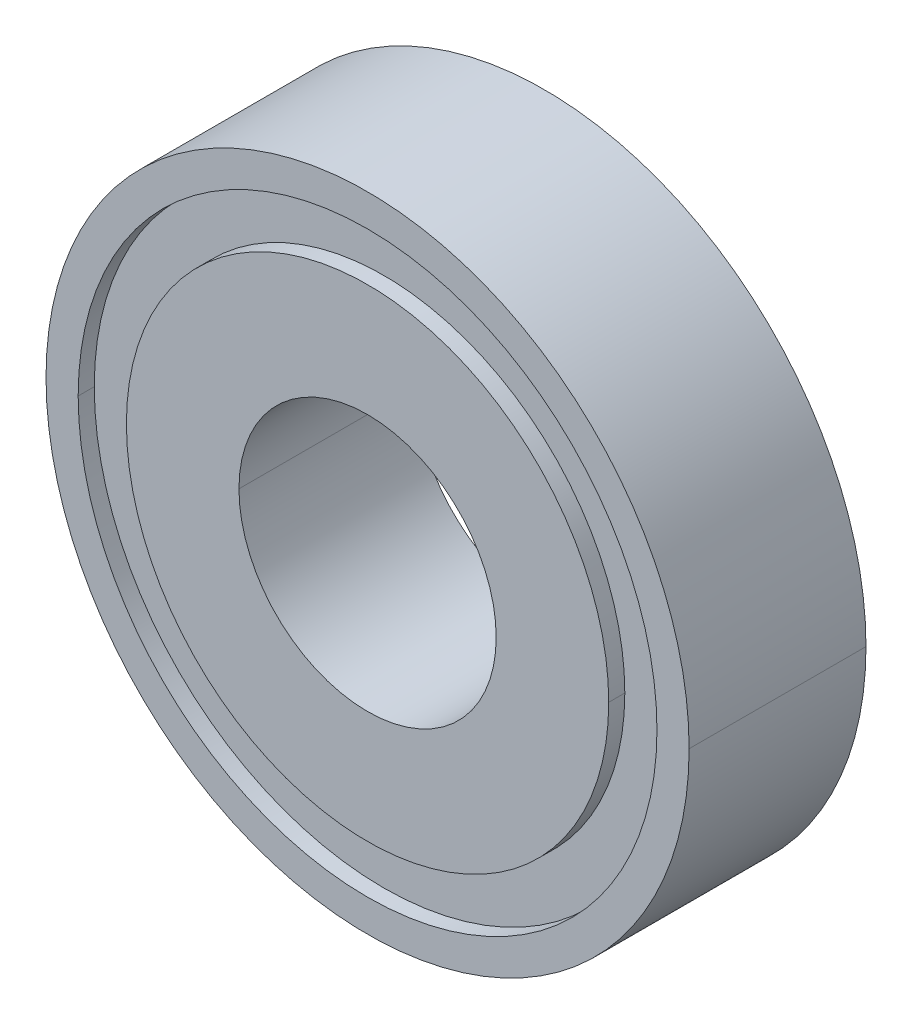
ISO-10303-21;
HEADER;
FILE_DESCRIPTION(('STEP AP214'),'2;1');
FILE_NAME('part.step','',(''),(''),'','','');
FILE_SCHEMA(('AUTOMOTIVE_DESIGN { 1 0 10303 214 1 1 1 1 }'));
ENDSEC;
DATA;
#1=APPLICATION_CONTEXT('core data for automotive mechanical design processes');
#2=APPLICATION_PROTOCOL_DEFINITION('international standard','automotive_design',2000,#1);
#3=PRODUCT_CONTEXT('',#1,'mechanical');
#4=PRODUCT('Part','Part','',(#3));
#5=PRODUCT_RELATED_PRODUCT_CATEGORY('part','',(#4));
#6=PRODUCT_DEFINITION_FORMATION('','',#4);
#7=PRODUCT_DEFINITION_CONTEXT('part definition',#1,'design');
#8=PRODUCT_DEFINITION('design','',#6,#7);
#9=PRODUCT_DEFINITION_SHAPE('','',#8);
#10=(LENGTH_UNIT() NAMED_UNIT(*) SI_UNIT(.MILLI.,.METRE.));
#11=(NAMED_UNIT(*) PLANE_ANGLE_UNIT() SI_UNIT($,.RADIAN.));
#12=(NAMED_UNIT(*) SI_UNIT($,.STERADIAN.) SOLID_ANGLE_UNIT());
#13=UNCERTAINTY_MEASURE_WITH_UNIT(LENGTH_MEASURE(1.E-05),#10,'distance_accuracy_value','');
#14=(GEOMETRIC_REPRESENTATION_CONTEXT(3) GLOBAL_UNCERTAINTY_ASSIGNED_CONTEXT((#13)) GLOBAL_UNIT_ASSIGNED_CONTEXT((#10,
#11,#12)) REPRESENTATION_CONTEXT('',''));
#15=CARTESIAN_POINT('',(0.,0.,0.));
#16=DIRECTION('',(0.,0.,1.));
#17=DIRECTION('',(1.,0.,0.));
#18=AXIS2_PLACEMENT_3D('',#15,#16,#17);
#19=CARTESIAN_POINT('',(0.,0.,10.));
#20=DIRECTION('',(0.,0.,1.));
#21=DIRECTION('',(1.,0.,0.));
#22=AXIS2_PLACEMENT_3D('',#19,#20,#21);
#23=CYLINDRICAL_SURFACE('',#22,15.);
#24=CARTESIAN_POINT('',(0.,0.,10.));
#25=DIRECTION('',(0.,0.,1.));
#26=DIRECTION('',(1.,0.,0.));
#27=AXIS2_PLACEMENT_3D('',#24,#25,#26);
#28=CIRCLE('',#27,15.);
#29=CARTESIAN_POINT('',(15.,0.,10.));
#30=VERTEX_POINT('',#29);
#31=CARTESIAN_POINT('',(-15.,0.,10.));
#32=VERTEX_POINT('',#31);
#33=EDGE_CURVE('E11',#30,#32,#28,.T.);
#34=ORIENTED_EDGE('',*,*,#33,.T.);
#35=DIRECTION('',(0.,0.,1.));
#36=VECTOR('',#35,1.);
#37=CARTESIAN_POINT('',(-15.,0.,10.));
#38=LINE('',#37,#36);
#39=CARTESIAN_POINT('',(-15.,0.,11.));
#40=VERTEX_POINT('',#39);
#41=EDGE_CURVE('E28',#32,#40,#38,.T.);
#42=ORIENTED_EDGE('',*,*,#41,.T.);
#43=CARTESIAN_POINT('',(0.,0.,11.));
#44=DIRECTION('',(0.,0.,1.));
#45=DIRECTION('',(1.,0.,0.));
#46=AXIS2_PLACEMENT_3D('',#43,#44,#45);
#47=CIRCLE('',#46,15.);
#48=CARTESIAN_POINT('',(15.,0.,11.));
#49=VERTEX_POINT('',#48);
#50=EDGE_CURVE('E187',#49,#40,#47,.T.);
#51=ORIENTED_EDGE('',*,*,#50,.F.);
#52=DIRECTION('',(0.,0.,1.));
#53=VECTOR('',#52,1.);
#54=CARTESIAN_POINT('',(15.,0.,10.));
#55=LINE('',#54,#53);
#56=EDGE_CURVE('E180',#30,#49,#55,.T.);
#57=ORIENTED_EDGE('',*,*,#56,.F.);
#58=EDGE_LOOP('',(#34,#42,#51,#57));
#59=FACE_BOUND('',#58,.T.);
#60=ADVANCED_FACE('F17',(#59),#23,.T.);
#61=CARTESIAN_POINT('',(0.,0.,10.));
#62=DIRECTION('',(0.,0.,1.));
#63=DIRECTION('',(1.,0.,0.));
#64=AXIS2_PLACEMENT_3D('',#61,#62,#63);
#65=CYLINDRICAL_SURFACE('',#64,18.);
#66=CARTESIAN_POINT('',(0.,0.,10.));
#67=DIRECTION('',(0.,0.,1.));
#68=DIRECTION('',(1.,0.,0.));
#69=AXIS2_PLACEMENT_3D('',#66,#67,#68);
#70=CIRCLE('',#69,18.);
#71=CARTESIAN_POINT('',(-18.,0.,10.));
#72=VERTEX_POINT('',#71);
#73=CARTESIAN_POINT('',(18.,0.,10.));
#74=VERTEX_POINT('',#73);
#75=EDGE_CURVE('E153',#72,#74,#70,.T.);
#76=ORIENTED_EDGE('',*,*,#75,.F.);
#77=DIRECTION('',(0.,0.,1.));
#78=VECTOR('',#77,1.);
#79=CARTESIAN_POINT('',(-18.,0.,10.));
#80=LINE('',#79,#78);
#81=CARTESIAN_POINT('',(-18.,0.,11.));
#82=VERTEX_POINT('',#81);
#83=EDGE_CURVE('E158',#72,#82,#80,.T.);
#84=ORIENTED_EDGE('',*,*,#83,.T.);
#85=CARTESIAN_POINT('',(0.,0.,11.));
#86=DIRECTION('',(0.,0.,1.));
#87=DIRECTION('',(1.,0.,0.));
#88=AXIS2_PLACEMENT_3D('',#85,#86,#87);
#89=CIRCLE('',#88,18.);
#90=CARTESIAN_POINT('',(18.,0.,11.));
#91=VERTEX_POINT('',#90);
#92=EDGE_CURVE('E139',#82,#91,#89,.T.);
#93=ORIENTED_EDGE('',*,*,#92,.T.);
#94=DIRECTION('',(0.,0.,1.));
#95=VECTOR('',#94,1.);
#96=CARTESIAN_POINT('',(18.,0.,10.));
#97=LINE('',#96,#95);
#98=EDGE_CURVE('E135',#74,#91,#97,.T.);
#99=ORIENTED_EDGE('',*,*,#98,.F.);
#100=EDGE_LOOP('',(#76,#84,#93,#99));
#101=FACE_BOUND('',#100,.T.);
#102=ADVANCED_FACE('F247',(#101),#65,.F.);
#103=CARTESIAN_POINT('',(0.,0.,11.));
#104=DIRECTION('',(0.,0.,-1.));
#105=DIRECTION('',(-1.,0.,0.));
#106=AXIS2_PLACEMENT_3D('',#103,#104,#105);
#107=CYLINDRICAL_SURFACE('',#106,8.);
#108=CARTESIAN_POINT('',(0.,0.,11.));
#109=DIRECTION('',(0.,0.,1.));
#110=DIRECTION('',(1.,0.,0.));
#111=AXIS2_PLACEMENT_3D('',#108,#109,#110);
#112=CIRCLE('',#111,8.);
#113=CARTESIAN_POINT('',(-8.,0.,11.));
#114=VERTEX_POINT('',#113);
#115=CARTESIAN_POINT('',(8.,0.,11.));
#116=VERTEX_POINT('',#115);
#117=EDGE_CURVE('E131',#114,#116,#112,.T.);
#118=ORIENTED_EDGE('',*,*,#117,.T.);
#119=DIRECTION('',(0.,0.,-1.));
#120=VECTOR('',#119,1.);
#121=CARTESIAN_POINT('',(8.,0.,11.));
#122=LINE('',#121,#120);
#123=CARTESIAN_POINT('',(8.,0.,0.));
#124=VERTEX_POINT('',#123);
#125=EDGE_CURVE('E140',#116,#124,#122,.T.);
#126=ORIENTED_EDGE('',*,*,#125,.T.);
#127=CARTESIAN_POINT('',(0.,0.,0.));
#128=DIRECTION('',(0.,0.,1.));
#129=DIRECTION('',(1.,0.,0.));
#130=AXIS2_PLACEMENT_3D('',#127,#128,#129);
#131=CIRCLE('',#130,8.);
#132=CARTESIAN_POINT('',(-8.,0.,0.));
#133=VERTEX_POINT('',#132);
#134=EDGE_CURVE('E114',#133,#124,#131,.T.);
#135=ORIENTED_EDGE('',*,*,#134,.F.);
#136=DIRECTION('',(0.,0.,-1.));
#137=VECTOR('',#136,1.);
#138=CARTESIAN_POINT('',(-8.,0.,11.));
#139=LINE('',#138,#137);
#140=EDGE_CURVE('E124',#114,#133,#139,.T.);
#141=ORIENTED_EDGE('',*,*,#140,.F.);
#142=EDGE_LOOP('',(#118,#126,#135,#141));
#143=FACE_BOUND('',#142,.T.);
#144=ADVANCED_FACE('F130',(#143),#107,.F.);
#145=CARTESIAN_POINT('',(0.,0.,11.));
#146=DIRECTION('',(0.,0.,-1.));
#147=DIRECTION('',(-1.,0.,0.));
#148=AXIS2_PLACEMENT_3D('',#145,#146,#147);
#149=CYLINDRICAL_SURFACE('',#148,20.);
#150=CARTESIAN_POINT('',(0.,0.,11.));
#151=DIRECTION('',(0.,0.,1.));
#152=DIRECTION('',(1.,0.,0.));
#153=AXIS2_PLACEMENT_3D('',#150,#151,#152);
#154=CIRCLE('',#153,20.);
#155=CARTESIAN_POINT('',(20.,0.,11.));
#156=VERTEX_POINT('',#155);
#157=CARTESIAN_POINT('',(-20.,0.,11.));
#158=VERTEX_POINT('',#157);
#159=EDGE_CURVE('E185',#156,#158,#154,.T.);
#160=ORIENTED_EDGE('',*,*,#159,.F.);
#161=DIRECTION('',(0.,0.,-1.));
#162=VECTOR('',#161,1.);
#163=CARTESIAN_POINT('',(20.,0.,11.));
#164=LINE('',#163,#162);
#165=CARTESIAN_POINT('',(20.,0.,0.));
#166=VERTEX_POINT('',#165);
#167=EDGE_CURVE('E177',#156,#166,#164,.T.);
#168=ORIENTED_EDGE('',*,*,#167,.T.);
#169=CARTESIAN_POINT('',(0.,0.,0.));
#170=DIRECTION('',(0.,0.,1.));
#171=DIRECTION('',(1.,0.,0.));
#172=AXIS2_PLACEMENT_3D('',#169,#170,#171);
#173=CIRCLE('',#172,20.);
#174=CARTESIAN_POINT('',(-20.,0.,0.));
#175=VERTEX_POINT('',#174);
#176=EDGE_CURVE('E95',#166,#175,#173,.T.);
#177=ORIENTED_EDGE('',*,*,#176,.T.);
#178=DIRECTION('',(0.,0.,-1.));
#179=VECTOR('',#178,1.);
#180=CARTESIAN_POINT('',(-20.,0.,11.));
#181=LINE('',#180,#179);
#182=EDGE_CURVE('E107',#158,#175,#181,.T.);
#183=ORIENTED_EDGE('',*,*,#182,.F.);
#184=EDGE_LOOP('',(#160,#168,#177,#183));
#185=FACE_BOUND('',#184,.T.);
#186=ADVANCED_FACE('F208',(#185),#149,.T.);
#187=CARTESIAN_POINT('',(0.,0.,11.));
#188=DIRECTION('',(0.,0.,1.));
#189=DIRECTION('',(1.,0.,0.));
#190=AXIS2_PLACEMENT_3D('',#187,#188,#189);
#191=PLANE('',#190);
#192=ORIENTED_EDGE('',*,*,#50,.T.);
#193=CARTESIAN_POINT('',(0.,0.,11.));
#194=DIRECTION('',(0.,0.,1.));
#195=DIRECTION('',(1.,0.,0.));
#196=AXIS2_PLACEMENT_3D('',#193,#194,#195);
#197=CIRCLE('',#196,15.);
#198=EDGE_CURVE('E190',#40,#49,#197,.T.);
#199=ORIENTED_EDGE('',*,*,#198,.T.);
#200=EDGE_LOOP('',(#192,#199));
#201=FACE_BOUND('',#200,.T.);
#202=ORIENTED_EDGE('',*,*,#117,.F.);
#203=CARTESIAN_POINT('',(0.,0.,11.));
#204=DIRECTION('',(0.,0.,1.));
#205=DIRECTION('',(1.,0.,0.));
#206=AXIS2_PLACEMENT_3D('',#203,#204,#205);
#207=CIRCLE('',#206,8.);
#208=EDGE_CURVE('E134',#116,#114,#207,.T.);
#209=ORIENTED_EDGE('',*,*,#208,.F.);
#210=EDGE_LOOP('',(#202,#209));
#211=FACE_BOUND('',#210,.T.);
#212=ADVANCED_FACE('F19',(#201,#211),#191,.T.);
#213=CARTESIAN_POINT('',(0.,0.,11.));
#214=DIRECTION('',(0.,0.,1.));
#215=DIRECTION('',(1.,0.,0.));
#216=AXIS2_PLACEMENT_3D('',#213,#214,#215);
#217=PLANE('',#216);
#218=CARTESIAN_POINT('',(0.,0.,11.));
#219=DIRECTION('',(0.,0.,1.));
#220=DIRECTION('',(1.,0.,0.));
#221=AXIS2_PLACEMENT_3D('',#218,#219,#220);
#222=CIRCLE('',#221,20.);
#223=EDGE_CURVE('E198',#158,#156,#222,.T.);
#224=ORIENTED_EDGE('',*,*,#223,.T.);
#225=ORIENTED_EDGE('',*,*,#159,.T.);
#226=EDGE_LOOP('',(#224,#225));
#227=FACE_BOUND('',#226,.T.);
#228=CARTESIAN_POINT('',(0.,0.,11.));
#229=DIRECTION('',(0.,0.,1.));
#230=DIRECTION('',(1.,0.,0.));
#231=AXIS2_PLACEMENT_3D('',#228,#229,#230);
#232=CIRCLE('',#231,18.);
#233=EDGE_CURVE('E193',#91,#82,#232,.T.);
#234=ORIENTED_EDGE('',*,*,#233,.F.);
#235=ORIENTED_EDGE('',*,*,#92,.F.);
#236=EDGE_LOOP('',(#234,#235));
#237=FACE_BOUND('',#236,.T.);
#238=ADVANCED_FACE('F214',(#227,#237),#217,.T.);
#239=CARTESIAN_POINT('',(0.,0.,0.));
#240=DIRECTION('',(0.,0.,1.));
#241=DIRECTION('',(1.,0.,0.));
#242=AXIS2_PLACEMENT_3D('',#239,#240,#241);
#243=PLANE('',#242);
#244=CARTESIAN_POINT('',(0.,0.,0.));
#245=DIRECTION('',(0.,0.,1.));
#246=DIRECTION('',(1.,0.,0.));
#247=AXIS2_PLACEMENT_3D('',#244,#245,#246);
#248=CIRCLE('',#247,20.);
#249=EDGE_CURVE('E144',#175,#166,#248,.T.);
#250=ORIENTED_EDGE('',*,*,#249,.F.);
#251=ORIENTED_EDGE('',*,*,#176,.F.);
#252=EDGE_LOOP('',(#250,#251));
#253=FACE_BOUND('',#252,.T.);
#254=ORIENTED_EDGE('',*,*,#134,.T.);
#255=CARTESIAN_POINT('',(0.,0.,0.));
#256=DIRECTION('',(0.,0.,1.));
#257=DIRECTION('',(1.,0.,0.));
#258=AXIS2_PLACEMENT_3D('',#255,#256,#257);
#259=CIRCLE('',#258,8.);
#260=EDGE_CURVE('E186',#124,#133,#259,.T.);
#261=ORIENTED_EDGE('',*,*,#260,.T.);
#262=EDGE_LOOP('',(#254,#261));
#263=FACE_BOUND('',#262,.T.);
#264=ADVANCED_FACE('F211',(#253,#263),#243,.F.);
#265=CARTESIAN_POINT('',(0.,0.,11.));
#266=DIRECTION('',(0.,0.,-1.));
#267=DIRECTION('',(-1.,0.,0.));
#268=AXIS2_PLACEMENT_3D('',#265,#266,#267);
#269=CYLINDRICAL_SURFACE('',#268,20.);
#270=ORIENTED_EDGE('',*,*,#167,.F.);
#271=ORIENTED_EDGE('',*,*,#223,.F.);
#272=ORIENTED_EDGE('',*,*,#182,.T.);
#273=ORIENTED_EDGE('',*,*,#249,.T.);
#274=EDGE_LOOP('',(#270,#271,#272,#273));
#275=FACE_BOUND('',#274,.T.);
#276=ADVANCED_FACE('F212',(#275),#269,.T.);
#277=CARTESIAN_POINT('',(0.,0.,11.));
#278=DIRECTION('',(0.,0.,-1.));
#279=DIRECTION('',(-1.,0.,0.));
#280=AXIS2_PLACEMENT_3D('',#277,#278,#279);
#281=CYLINDRICAL_SURFACE('',#280,8.);
#282=ORIENTED_EDGE('',*,*,#125,.F.);
#283=ORIENTED_EDGE('',*,*,#208,.T.);
#284=ORIENTED_EDGE('',*,*,#140,.T.);
#285=ORIENTED_EDGE('',*,*,#260,.F.);
#286=EDGE_LOOP('',(#282,#283,#284,#285));
#287=FACE_BOUND('',#286,.T.);
#288=ADVANCED_FACE('F142',(#287),#281,.F.);
#289=CARTESIAN_POINT('',(0.,0.,10.));
#290=DIRECTION('',(0.,0.,1.));
#291=DIRECTION('',(1.,0.,0.));
#292=AXIS2_PLACEMENT_3D('',#289,#290,#291);
#293=CYLINDRICAL_SURFACE('',#292,18.);
#294=ORIENTED_EDGE('',*,*,#83,.F.);
#295=CARTESIAN_POINT('',(0.,0.,10.));
#296=DIRECTION('',(0.,0.,1.));
#297=DIRECTION('',(1.,0.,0.));
#298=AXIS2_PLACEMENT_3D('',#295,#296,#297);
#299=CIRCLE('',#298,18.);
#300=EDGE_CURVE('E21',#74,#72,#299,.T.);
#301=ORIENTED_EDGE('',*,*,#300,.F.);
#302=ORIENTED_EDGE('',*,*,#98,.T.);
#303=ORIENTED_EDGE('',*,*,#233,.T.);
#304=EDGE_LOOP('',(#294,#301,#302,#303));
#305=FACE_BOUND('',#304,.T.);
#306=ADVANCED_FACE('F233',(#305),#293,.F.);
#307=CARTESIAN_POINT('',(0.,0.,10.));
#308=DIRECTION('',(0.,0.,1.));
#309=DIRECTION('',(1.,0.,0.));
#310=AXIS2_PLACEMENT_3D('',#307,#308,#309);
#311=PLANE('',#310);
#312=ORIENTED_EDGE('',*,*,#300,.T.);
#313=ORIENTED_EDGE('',*,*,#75,.T.);
#314=EDGE_LOOP('',(#312,#313));
#315=FACE_BOUND('',#314,.T.);
#316=ORIENTED_EDGE('',*,*,#33,.F.);
#317=CARTESIAN_POINT('',(0.,0.,10.));
#318=DIRECTION('',(0.,0.,1.));
#319=DIRECTION('',(1.,0.,0.));
#320=AXIS2_PLACEMENT_3D('',#317,#318,#319);
#321=CIRCLE('',#320,15.);
#322=EDGE_CURVE('E155',#32,#30,#321,.T.);
#323=ORIENTED_EDGE('',*,*,#322,.F.);
#324=EDGE_LOOP('',(#316,#323));
#325=FACE_BOUND('',#324,.T.);
#326=ADVANCED_FACE('F231',(#315,#325),#311,.T.);
#327=CARTESIAN_POINT('',(0.,0.,10.));
#328=DIRECTION('',(0.,0.,1.));
#329=DIRECTION('',(1.,0.,0.));
#330=AXIS2_PLACEMENT_3D('',#327,#328,#329);
#331=CYLINDRICAL_SURFACE('',#330,15.);
#332=ORIENTED_EDGE('',*,*,#41,.F.);
#333=ORIENTED_EDGE('',*,*,#322,.T.);
#334=ORIENTED_EDGE('',*,*,#56,.T.);
#335=ORIENTED_EDGE('',*,*,#198,.F.);
#336=EDGE_LOOP('',(#332,#333,#334,#335));
#337=FACE_BOUND('',#336,.T.);
#338=ADVANCED_FACE('F226',(#337),#331,.T.);
#339=CLOSED_SHELL('',(#60,#102,#144,#186,#212,#238,#264,#276,#288,#306,#326,#338));
#340=MANIFOLD_SOLID_BREP('B1',#339);
#341=ADVANCED_BREP_SHAPE_REPRESENTATION('',(#18,#340),#14);
#342=SHAPE_DEFINITION_REPRESENTATION(#9,#341);
ENDSEC;
END-ISO-10303-21;
